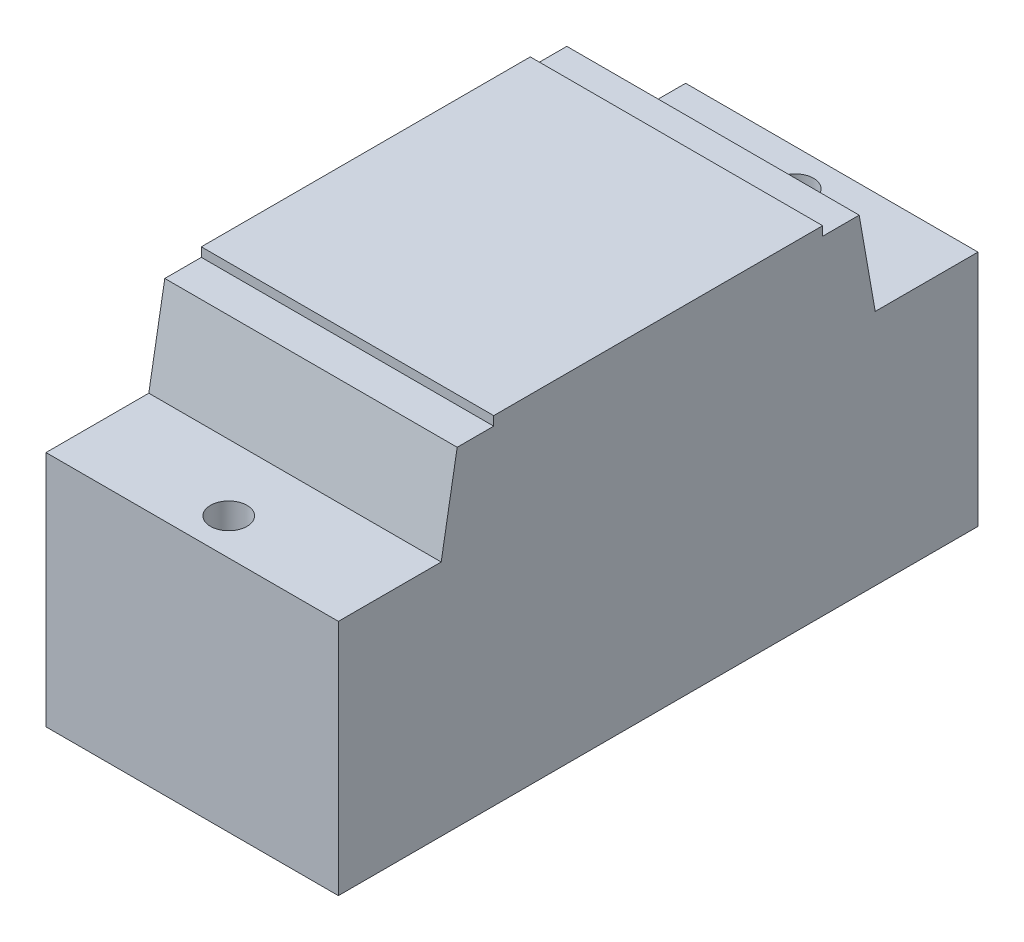
ISO-10303-21;
HEADER;
FILE_DESCRIPTION(('STEP AP214'),'2;1');
FILE_NAME('part.step','',(''),(''),'','','');
FILE_SCHEMA(('AUTOMOTIVE_DESIGN { 1 0 10303 214 1 1 1 1 }'));
ENDSEC;
DATA;
#1=APPLICATION_CONTEXT('core data for automotive mechanical design processes');
#2=APPLICATION_PROTOCOL_DEFINITION('international standard','automotive_design',2000,#1);
#3=PRODUCT_CONTEXT('',#1,'mechanical');
#4=PRODUCT('Part','Part','',(#3));
#5=PRODUCT_RELATED_PRODUCT_CATEGORY('part','',(#4));
#6=PRODUCT_DEFINITION_FORMATION('','',#4);
#7=PRODUCT_DEFINITION_CONTEXT('part definition',#1,'design');
#8=PRODUCT_DEFINITION('design','',#6,#7);
#9=PRODUCT_DEFINITION_SHAPE('','',#8);
#10=(LENGTH_UNIT() NAMED_UNIT(*) SI_UNIT(.MILLI.,.METRE.));
#11=(NAMED_UNIT(*) PLANE_ANGLE_UNIT() SI_UNIT($,.RADIAN.));
#12=(NAMED_UNIT(*) SI_UNIT($,.STERADIAN.) SOLID_ANGLE_UNIT());
#13=UNCERTAINTY_MEASURE_WITH_UNIT(LENGTH_MEASURE(1.E-05),#10,'distance_accuracy_value','');
#14=(GEOMETRIC_REPRESENTATION_CONTEXT(3) GLOBAL_UNCERTAINTY_ASSIGNED_CONTEXT((#13)) GLOBAL_UNIT_ASSIGNED_CONTEXT((#10,
#11,#12)) REPRESENTATION_CONTEXT('',''));
#15=CARTESIAN_POINT('',(0.,0.,0.));
#16=DIRECTION('',(0.,0.,1.));
#17=DIRECTION('',(1.,0.,0.));
#18=AXIS2_PLACEMENT_3D('',#15,#16,#17);
#19=CARTESIAN_POINT('',(0.,26.,0.));
#20=DIRECTION('',(0.,1.,0.));
#21=DIRECTION('',(0.,0.,1.));
#22=AXIS2_PLACEMENT_3D('',#19,#20,#21);
#23=PLANE('',#22);
#24=CARTESIAN_POINT('',(0.,26.,-31.));
#25=DIRECTION('',(0.,1.,0.));
#26=DIRECTION('',(0.,0.,1.));
#27=AXIS2_PLACEMENT_3D('',#24,#25,#26);
#28=CIRCLE('',#27,2.);
#29=CARTESIAN_POINT('',(0.,26.,-29.));
#30=VERTEX_POINT('',#29);
#31=EDGE_CURVE('E216',#30,#30,#28,.T.);
#32=ORIENTED_EDGE('',*,*,#31,.F.);
#33=EDGE_LOOP('',(#32));
#34=FACE_BOUND('',#33,.T.);
#35=DIRECTION('',(0.,0.,1.));
#36=VECTOR('',#35,1.);
#37=CARTESIAN_POINT('',(-16.,26.,-35.));
#38=LINE('',#37,#36);
#39=CARTESIAN_POINT('',(-16.,26.,-35.));
#40=VERTEX_POINT('',#39);
#41=CARTESIAN_POINT('',(-16.,26.,-23.75));
#42=VERTEX_POINT('',#41);
#43=EDGE_CURVE('E141',#40,#42,#38,.T.);
#44=ORIENTED_EDGE('',*,*,#43,.T.);
#45=DIRECTION('',(1.,0.,0.));
#46=VECTOR('',#45,1.);
#47=CARTESIAN_POINT('',(-16.,26.,-23.75));
#48=LINE('',#47,#46);
#49=CARTESIAN_POINT('',(16.,26.,-23.75));
#50=VERTEX_POINT('',#49);
#51=EDGE_CURVE('E147',#42,#50,#48,.T.);
#52=ORIENTED_EDGE('',*,*,#51,.T.);
#53=DIRECTION('',(0.,0.,-1.));
#54=VECTOR('',#53,1.);
#55=CARTESIAN_POINT('',(16.,26.,-35.));
#56=LINE('',#55,#54);
#57=CARTESIAN_POINT('',(16.,26.,-35.));
#58=VERTEX_POINT('',#57);
#59=EDGE_CURVE('E88',#50,#58,#56,.T.);
#60=ORIENTED_EDGE('',*,*,#59,.T.);
#61=DIRECTION('',(-1.,0.,0.));
#62=VECTOR('',#61,1.);
#63=CARTESIAN_POINT('',(-16.,26.,-35.));
#64=LINE('',#63,#62);
#65=EDGE_CURVE('E152',#58,#40,#64,.T.);
#66=ORIENTED_EDGE('',*,*,#65,.T.);
#67=EDGE_LOOP('',(#44,#52,#60,#66));
#68=FACE_BOUND('',#67,.T.);
#69=ADVANCED_FACE('F36',(#34,#68),#23,.T.);
#70=CARTESIAN_POINT('',(16.,26.,-35.));
#71=DIRECTION('',(-1.,0.,0.));
#72=DIRECTION('',(0.,0.,1.));
#73=AXIS2_PLACEMENT_3D('',#70,#71,#72);
#74=PLANE('',#73);
#75=DIRECTION('',(0.,0.,-1.));
#76=VECTOR('',#75,1.);
#77=CARTESIAN_POINT('',(16.,0.,-35.));
#78=LINE('',#77,#76);
#79=CARTESIAN_POINT('',(16.,0.,35.));
#80=VERTEX_POINT('',#79);
#81=CARTESIAN_POINT('',(16.,0.,-35.));
#82=VERTEX_POINT('',#81);
#83=EDGE_CURVE('E161',#80,#82,#78,.T.);
#84=ORIENTED_EDGE('',*,*,#83,.T.);
#85=DIRECTION('',(0.,-1.,0.));
#86=VECTOR('',#85,1.);
#87=CARTESIAN_POINT('',(16.,26.,-35.));
#88=LINE('',#87,#86);
#89=EDGE_CURVE('E11',#58,#82,#88,.T.);
#90=ORIENTED_EDGE('',*,*,#89,.F.);
#91=ORIENTED_EDGE('',*,*,#59,.F.);
#92=DIRECTION('',(0.,-0.985030467155705,-0.172380331752247));
#93=VECTOR('',#92,1.);
#94=CARTESIAN_POINT('',(16.,4.8053365676167,-27.4590661006671));
#95=LINE('',#94,#93);
#96=CARTESIAN_POINT('',(16.,36.,-22.));
#97=VERTEX_POINT('',#96);
#98=EDGE_CURVE('E51',#97,#50,#95,.T.);
#99=ORIENTED_EDGE('',*,*,#98,.F.);
#100=DIRECTION('',(0.,0.,-1.));
#101=VECTOR('',#100,1.);
#102=CARTESIAN_POINT('',(16.,36.,0.));
#103=LINE('',#102,#101);
#104=CARTESIAN_POINT('',(16.,36.,-17.9999999999999));
#105=VERTEX_POINT('',#104);
#106=EDGE_CURVE('E209',#105,#97,#103,.T.);
#107=ORIENTED_EDGE('',*,*,#106,.F.);
#108=DIRECTION('',(0.,-1.,0.));
#109=VECTOR('',#108,1.);
#110=CARTESIAN_POINT('',(16.,0.,-17.9999999999999));
#111=LINE('',#110,#109);
#112=CARTESIAN_POINT('',(16.,37.,-17.9999999999999));
#113=VERTEX_POINT('',#112);
#114=EDGE_CURVE('E212',#113,#105,#111,.T.);
#115=ORIENTED_EDGE('',*,*,#114,.F.);
#116=DIRECTION('',(0.,0.,-1.));
#117=VECTOR('',#116,1.);
#118=CARTESIAN_POINT('',(16.,37.,0.));
#119=LINE('',#118,#117);
#120=CARTESIAN_POINT('',(16.,37.,18.0000000000001));
#121=VERTEX_POINT('',#120);
#122=EDGE_CURVE('E222',#121,#113,#119,.T.);
#123=ORIENTED_EDGE('',*,*,#122,.F.);
#124=DIRECTION('',(0.,-1.,0.));
#125=VECTOR('',#124,1.);
#126=CARTESIAN_POINT('',(16.,0.,18.0000000000001));
#127=LINE('',#126,#125);
#128=CARTESIAN_POINT('',(16.,36.,18.0000000000001));
#129=VERTEX_POINT('',#128);
#130=EDGE_CURVE('E223',#121,#129,#127,.T.);
#131=ORIENTED_EDGE('',*,*,#130,.T.);
#132=CARTESIAN_POINT('',(16.,36.,22.));
#133=VERTEX_POINT('',#132);
#134=EDGE_CURVE('E214',#133,#129,#103,.T.);
#135=ORIENTED_EDGE('',*,*,#134,.F.);
#136=DIRECTION('',(0.,-0.985030467155704,0.17238033175225));
#137=VECTOR('',#136,1.);
#138=CARTESIAN_POINT('',(16.,4.80533656761679,27.4590661006671));
#139=LINE('',#138,#137);
#140=CARTESIAN_POINT('',(16.,26.,23.75));
#141=VERTEX_POINT('',#140);
#142=EDGE_CURVE('E145',#133,#141,#139,.T.);
#143=ORIENTED_EDGE('',*,*,#142,.T.);
#144=CARTESIAN_POINT('',(16.,26.,35.));
#145=VERTEX_POINT('',#144);
#146=EDGE_CURVE('E182',#145,#141,#56,.T.);
#147=ORIENTED_EDGE('',*,*,#146,.F.);
#148=DIRECTION('',(0.,-1.,0.));
#149=VECTOR('',#148,1.);
#150=CARTESIAN_POINT('',(16.,26.,35.));
#151=LINE('',#150,#149);
#152=EDGE_CURVE('E156',#145,#80,#151,.T.);
#153=ORIENTED_EDGE('',*,*,#152,.T.);
#154=EDGE_LOOP('',(#84,#90,#91,#99,#107,#115,#123,#131,#135,#143,#147,#153));
#155=FACE_BOUND('',#154,.T.);
#156=ADVANCED_FACE('F38',(#155),#74,.F.);
#157=CARTESIAN_POINT('',(-16.,26.,-35.));
#158=DIRECTION('',(0.,0.,1.));
#159=DIRECTION('',(1.,0.,0.));
#160=AXIS2_PLACEMENT_3D('',#157,#158,#159);
#161=PLANE('',#160);
#162=DIRECTION('',(-1.,0.,0.));
#163=VECTOR('',#162,1.);
#164=CARTESIAN_POINT('',(-16.,0.,-35.));
#165=LINE('',#164,#163);
#166=CARTESIAN_POINT('',(-16.,0.,-35.));
#167=VERTEX_POINT('',#166);
#168=EDGE_CURVE('E164',#82,#167,#165,.T.);
#169=ORIENTED_EDGE('',*,*,#168,.T.);
#170=DIRECTION('',(0.,-1.,0.));
#171=VECTOR('',#170,1.);
#172=CARTESIAN_POINT('',(-16.,26.,-35.));
#173=LINE('',#172,#171);
#174=EDGE_CURVE('E44',#40,#167,#173,.T.);
#175=ORIENTED_EDGE('',*,*,#174,.F.);
#176=ORIENTED_EDGE('',*,*,#65,.F.);
#177=ORIENTED_EDGE('',*,*,#89,.T.);
#178=EDGE_LOOP('',(#169,#175,#176,#177));
#179=FACE_BOUND('',#178,.T.);
#180=ADVANCED_FACE('F271',(#179),#161,.F.);
#181=CARTESIAN_POINT('',(-16.,26.,-35.));
#182=DIRECTION('',(1.,0.,0.));
#183=DIRECTION('',(0.,0.,-1.));
#184=AXIS2_PLACEMENT_3D('',#181,#182,#183);
#185=PLANE('',#184);
#186=DIRECTION('',(0.,0.,1.));
#187=VECTOR('',#186,1.);
#188=CARTESIAN_POINT('',(-16.,0.,-35.));
#189=LINE('',#188,#187);
#190=CARTESIAN_POINT('',(-16.,0.,35.));
#191=VERTEX_POINT('',#190);
#192=EDGE_CURVE('E167',#167,#191,#189,.T.);
#193=ORIENTED_EDGE('',*,*,#192,.T.);
#194=DIRECTION('',(0.,-1.,0.));
#195=VECTOR('',#194,1.);
#196=CARTESIAN_POINT('',(-16.,26.,35.));
#197=LINE('',#196,#195);
#198=CARTESIAN_POINT('',(-16.,26.,35.));
#199=VERTEX_POINT('',#198);
#200=EDGE_CURVE('E171',#199,#191,#197,.T.);
#201=ORIENTED_EDGE('',*,*,#200,.F.);
#202=CARTESIAN_POINT('',(-16.,26.,23.75));
#203=VERTEX_POINT('',#202);
#204=EDGE_CURVE('E154',#203,#199,#38,.T.);
#205=ORIENTED_EDGE('',*,*,#204,.F.);
#206=DIRECTION('',(0.,-0.985030467155704,0.17238033175225));
#207=VECTOR('',#206,1.);
#208=CARTESIAN_POINT('',(-16.,4.80533656761679,27.4590661006671));
#209=LINE('',#208,#207);
#210=CARTESIAN_POINT('',(-16.,36.,22.));
#211=VERTEX_POINT('',#210);
#212=EDGE_CURVE('E150',#211,#203,#209,.T.);
#213=ORIENTED_EDGE('',*,*,#212,.F.);
#214=DIRECTION('',(0.,0.,-1.));
#215=VECTOR('',#214,1.);
#216=CARTESIAN_POINT('',(-16.,36.,0.));
#217=LINE('',#216,#215);
#218=CARTESIAN_POINT('',(-16.,36.,18.0000000000001));
#219=VERTEX_POINT('',#218);
#220=EDGE_CURVE('E233',#211,#219,#217,.T.);
#221=ORIENTED_EDGE('',*,*,#220,.T.);
#222=DIRECTION('',(0.,-1.,0.));
#223=VECTOR('',#222,1.);
#224=CARTESIAN_POINT('',(-16.,0.,18.0000000000001));
#225=LINE('',#224,#223);
#226=CARTESIAN_POINT('',(-16.,37.,18.0000000000001));
#227=VERTEX_POINT('',#226);
#228=EDGE_CURVE('E237',#227,#219,#225,.T.);
#229=ORIENTED_EDGE('',*,*,#228,.F.);
#230=DIRECTION('',(0.,0.,-1.));
#231=VECTOR('',#230,1.);
#232=CARTESIAN_POINT('',(-16.,37.,0.));
#233=LINE('',#232,#231);
#234=CARTESIAN_POINT('',(-16.,37.,-17.9999999999999));
#235=VERTEX_POINT('',#234);
#236=EDGE_CURVE('E239',#227,#235,#233,.T.);
#237=ORIENTED_EDGE('',*,*,#236,.T.);
#238=DIRECTION('',(0.,-1.,0.));
#239=VECTOR('',#238,1.);
#240=CARTESIAN_POINT('',(-16.,0.,-17.9999999999999));
#241=LINE('',#240,#239);
#242=CARTESIAN_POINT('',(-16.,36.,-17.9999999999999));
#243=VERTEX_POINT('',#242);
#244=EDGE_CURVE('E241',#235,#243,#241,.T.);
#245=ORIENTED_EDGE('',*,*,#244,.T.);
#246=CARTESIAN_POINT('',(-16.,36.,-22.));
#247=VERTEX_POINT('',#246);
#248=EDGE_CURVE('E143',#243,#247,#217,.T.);
#249=ORIENTED_EDGE('',*,*,#248,.T.);
#250=DIRECTION('',(0.,-0.985030467155705,-0.172380331752247));
#251=VECTOR('',#250,1.);
#252=CARTESIAN_POINT('',(-16.,4.8053365676167,-27.459066100667));
#253=LINE('',#252,#251);
#254=EDGE_CURVE('E137',#247,#42,#253,.T.);
#255=ORIENTED_EDGE('',*,*,#254,.T.);
#256=ORIENTED_EDGE('',*,*,#43,.F.);
#257=ORIENTED_EDGE('',*,*,#174,.T.);
#258=EDGE_LOOP('',(#193,#201,#205,#213,#221,#229,#237,#245,#249,#255,#256,#257));
#259=FACE_BOUND('',#258,.T.);
#260=ADVANCED_FACE('F138',(#259),#185,.F.);
#261=CARTESIAN_POINT('',(-16.,26.,35.));
#262=DIRECTION('',(0.,0.,-1.));
#263=DIRECTION('',(-1.,0.,0.));
#264=AXIS2_PLACEMENT_3D('',#261,#262,#263);
#265=PLANE('',#264);
#266=DIRECTION('',(1.,0.,0.));
#267=VECTOR('',#266,1.);
#268=CARTESIAN_POINT('',(-16.,0.,35.));
#269=LINE('',#268,#267);
#270=EDGE_CURVE('E81',#191,#80,#269,.T.);
#271=ORIENTED_EDGE('',*,*,#270,.T.);
#272=ORIENTED_EDGE('',*,*,#152,.F.);
#273=DIRECTION('',(1.,0.,0.));
#274=VECTOR('',#273,1.);
#275=CARTESIAN_POINT('',(-16.,26.,35.));
#276=LINE('',#275,#274);
#277=EDGE_CURVE('E60',#199,#145,#276,.T.);
#278=ORIENTED_EDGE('',*,*,#277,.F.);
#279=ORIENTED_EDGE('',*,*,#200,.T.);
#280=EDGE_LOOP('',(#271,#272,#278,#279));
#281=FACE_BOUND('',#280,.T.);
#282=ADVANCED_FACE('F183',(#281),#265,.F.);
#283=CARTESIAN_POINT('',(0.,26.,31.));
#284=DIRECTION('',(0.,1.,0.));
#285=DIRECTION('',(0.,0.,1.));
#286=AXIS2_PLACEMENT_3D('',#283,#284,#285);
#287=CIRCLE('',#286,2.);
#288=CARTESIAN_POINT('',(0.,26.,33.));
#289=VERTEX_POINT('',#288);
#290=EDGE_CURVE('E210',#289,#289,#287,.T.);
#291=ORIENTED_EDGE('',*,*,#290,.F.);
#292=EDGE_LOOP('',(#291));
#293=FACE_BOUND('',#292,.T.);
#294=DIRECTION('',(1.,0.,0.));
#295=VECTOR('',#294,1.);
#296=CARTESIAN_POINT('',(-16.,26.,23.75));
#297=LINE('',#296,#295);
#298=EDGE_CURVE('E165',#203,#141,#297,.T.);
#299=ORIENTED_EDGE('',*,*,#298,.F.);
#300=ORIENTED_EDGE('',*,*,#204,.T.);
#301=ORIENTED_EDGE('',*,*,#277,.T.);
#302=ORIENTED_EDGE('',*,*,#146,.T.);
#303=EDGE_LOOP('',(#299,#300,#301,#302));
#304=FACE_BOUND('',#303,.T.);
#305=ADVANCED_FACE('F187',(#293,#304),#23,.T.);
#306=CARTESIAN_POINT('',(0.,0.,0.));
#307=DIRECTION('',(0.,1.,0.));
#308=DIRECTION('',(0.,0.,1.));
#309=AXIS2_PLACEMENT_3D('',#306,#307,#308);
#310=PLANE('',#309);
#311=CARTESIAN_POINT('',(0.,0.,31.));
#312=DIRECTION('',(0.,-1.,0.));
#313=DIRECTION('',(0.,0.,-1.));
#314=AXIS2_PLACEMENT_3D('',#311,#312,#313);
#315=CIRCLE('',#314,2.);
#316=CARTESIAN_POINT('',(0.,0.,29.));
#317=VERTEX_POINT('',#316);
#318=EDGE_CURVE('E290',#317,#317,#315,.T.);
#319=ORIENTED_EDGE('',*,*,#318,.F.);
#320=EDGE_LOOP('',(#319));
#321=FACE_BOUND('',#320,.T.);
#322=CARTESIAN_POINT('',(0.,0.,-31.));
#323=DIRECTION('',(0.,-1.,0.));
#324=DIRECTION('',(0.,0.,1.));
#325=AXIS2_PLACEMENT_3D('',#322,#323,#324);
#326=CIRCLE('',#325,2.);
#327=CARTESIAN_POINT('',(0.,0.,-29.));
#328=VERTEX_POINT('',#327);
#329=EDGE_CURVE('E291',#328,#328,#326,.T.);
#330=ORIENTED_EDGE('',*,*,#329,.F.);
#331=EDGE_LOOP('',(#330));
#332=FACE_BOUND('',#331,.T.);
#333=ORIENTED_EDGE('',*,*,#83,.F.);
#334=ORIENTED_EDGE('',*,*,#270,.F.);
#335=ORIENTED_EDGE('',*,*,#192,.F.);
#336=ORIENTED_EDGE('',*,*,#168,.F.);
#337=EDGE_LOOP('',(#333,#334,#335,#336));
#338=FACE_BOUND('',#337,.T.);
#339=ADVANCED_FACE('F177',(#321,#332,#338),#310,.F.);
#340=CARTESIAN_POINT('',(-16.,4.80533656761679,27.4590661006671));
#341=DIRECTION('',(0.,0.17238033175225,0.985030467155704));
#342=DIRECTION('',(0.,-0.985030467155704,0.17238033175225));
#343=AXIS2_PLACEMENT_3D('',#340,#341,#342);
#344=PLANE('',#343);
#345=ORIENTED_EDGE('',*,*,#142,.F.);
#346=DIRECTION('',(1.,0.,0.));
#347=VECTOR('',#346,1.);
#348=CARTESIAN_POINT('',(-16.,36.,22.));
#349=LINE('',#348,#347);
#350=EDGE_CURVE('E190',#211,#133,#349,.T.);
#351=ORIENTED_EDGE('',*,*,#350,.F.);
#352=ORIENTED_EDGE('',*,*,#212,.T.);
#353=ORIENTED_EDGE('',*,*,#298,.T.);
#354=EDGE_LOOP('',(#345,#351,#352,#353));
#355=FACE_BOUND('',#354,.T.);
#356=ADVANCED_FACE('F231',(#355),#344,.T.);
#357=CARTESIAN_POINT('',(-16.,36.,0.));
#358=DIRECTION('',(0.,-1.,0.));
#359=DIRECTION('',(0.,0.,-1.));
#360=AXIS2_PLACEMENT_3D('',#357,#358,#359);
#361=PLANE('',#360);
#362=ORIENTED_EDGE('',*,*,#134,.T.);
#363=DIRECTION('',(1.,0.,0.));
#364=VECTOR('',#363,1.);
#365=CARTESIAN_POINT('',(-16.,36.,18.0000000000001));
#366=LINE('',#365,#364);
#367=EDGE_CURVE('E192',#219,#129,#366,.T.);
#368=ORIENTED_EDGE('',*,*,#367,.F.);
#369=ORIENTED_EDGE('',*,*,#220,.F.);
#370=ORIENTED_EDGE('',*,*,#350,.T.);
#371=EDGE_LOOP('',(#362,#368,#369,#370));
#372=FACE_BOUND('',#371,.T.);
#373=ADVANCED_FACE('F234',(#372),#361,.F.);
#374=CARTESIAN_POINT('',(-16.,0.,18.0000000000001));
#375=DIRECTION('',(0.,0.,1.));
#376=DIRECTION('',(1.,0.,0.));
#377=AXIS2_PLACEMENT_3D('',#374,#375,#376);
#378=PLANE('',#377);
#379=ORIENTED_EDGE('',*,*,#130,.F.);
#380=DIRECTION('',(1.,0.,0.));
#381=VECTOR('',#380,1.);
#382=CARTESIAN_POINT('',(-16.,37.,18.0000000000001));
#383=LINE('',#382,#381);
#384=EDGE_CURVE('E198',#227,#121,#383,.T.);
#385=ORIENTED_EDGE('',*,*,#384,.F.);
#386=ORIENTED_EDGE('',*,*,#228,.T.);
#387=ORIENTED_EDGE('',*,*,#367,.T.);
#388=EDGE_LOOP('',(#379,#385,#386,#387));
#389=FACE_BOUND('',#388,.T.);
#390=ADVANCED_FACE('F264',(#389),#378,.T.);
#391=CARTESIAN_POINT('',(-16.,37.,0.));
#392=DIRECTION('',(0.,-1.,0.));
#393=DIRECTION('',(0.,0.,-1.));
#394=AXIS2_PLACEMENT_3D('',#391,#392,#393);
#395=PLANE('',#394);
#396=ORIENTED_EDGE('',*,*,#122,.T.);
#397=DIRECTION('',(1.,0.,0.));
#398=VECTOR('',#397,1.);
#399=CARTESIAN_POINT('',(-16.,37.,-17.9999999999999));
#400=LINE('',#399,#398);
#401=EDGE_CURVE('E200',#235,#113,#400,.T.);
#402=ORIENTED_EDGE('',*,*,#401,.F.);
#403=ORIENTED_EDGE('',*,*,#236,.F.);
#404=ORIENTED_EDGE('',*,*,#384,.T.);
#405=EDGE_LOOP('',(#396,#402,#403,#404));
#406=FACE_BOUND('',#405,.T.);
#407=ADVANCED_FACE('F248',(#406),#395,.F.);
#408=CARTESIAN_POINT('',(-16.,0.,-17.9999999999999));
#409=DIRECTION('',(0.,0.,1.));
#410=DIRECTION('',(1.,0.,0.));
#411=AXIS2_PLACEMENT_3D('',#408,#409,#410);
#412=PLANE('',#411);
#413=ORIENTED_EDGE('',*,*,#114,.T.);
#414=DIRECTION('',(1.,0.,0.));
#415=VECTOR('',#414,1.);
#416=CARTESIAN_POINT('',(-16.,36.,-17.9999999999999));
#417=LINE('',#416,#415);
#418=EDGE_CURVE('E203',#243,#105,#417,.T.);
#419=ORIENTED_EDGE('',*,*,#418,.F.);
#420=ORIENTED_EDGE('',*,*,#244,.F.);
#421=ORIENTED_EDGE('',*,*,#401,.T.);
#422=EDGE_LOOP('',(#413,#419,#420,#421));
#423=FACE_BOUND('',#422,.T.);
#424=ADVANCED_FACE('F250',(#423),#412,.F.);
#425=ORIENTED_EDGE('',*,*,#106,.T.);
#426=DIRECTION('',(1.,0.,0.));
#427=VECTOR('',#426,1.);
#428=CARTESIAN_POINT('',(-16.,36.,-22.));
#429=LINE('',#428,#427);
#430=EDGE_CURVE('E149',#247,#97,#429,.T.);
#431=ORIENTED_EDGE('',*,*,#430,.F.);
#432=ORIENTED_EDGE('',*,*,#248,.F.);
#433=ORIENTED_EDGE('',*,*,#418,.T.);
#434=EDGE_LOOP('',(#425,#431,#432,#433));
#435=FACE_BOUND('',#434,.T.);
#436=ADVANCED_FACE('F251',(#435),#361,.F.);
#437=CARTESIAN_POINT('',(-16.,4.8053365676167,-27.459066100667));
#438=DIRECTION('',(0.,-0.172380331752247,0.985030467155704));
#439=DIRECTION('',(0.,-0.985030467155705,-0.172380331752247));
#440=AXIS2_PLACEMENT_3D('',#437,#438,#439);
#441=PLANE('',#440);
#442=ORIENTED_EDGE('',*,*,#98,.T.);
#443=ORIENTED_EDGE('',*,*,#51,.F.);
#444=ORIENTED_EDGE('',*,*,#254,.F.);
#445=ORIENTED_EDGE('',*,*,#430,.T.);
#446=EDGE_LOOP('',(#442,#443,#444,#445));
#447=FACE_BOUND('',#446,.T.);
#448=ADVANCED_FACE('F148',(#447),#441,.F.);
#449=CARTESIAN_POINT('',(0.,37.,-31.));
#450=DIRECTION('',(0.,-1.,0.));
#451=DIRECTION('',(0.,0.,-1.));
#452=AXIS2_PLACEMENT_3D('',#449,#450,#451);
#453=CYLINDRICAL_SURFACE('',#452,2.);
#454=ORIENTED_EDGE('',*,*,#31,.T.);
#455=EDGE_LOOP('',(#454));
#456=FACE_BOUND('',#455,.T.);
#457=ORIENTED_EDGE('',*,*,#329,.T.);
#458=EDGE_LOOP('',(#457));
#459=FACE_BOUND('',#458,.T.);
#460=ADVANCED_FACE('F258',(#456,#459),#453,.F.);
#461=CARTESIAN_POINT('',(0.,37.,31.));
#462=DIRECTION('',(0.,-1.,0.));
#463=DIRECTION('',(0.,0.,-1.));
#464=AXIS2_PLACEMENT_3D('',#461,#462,#463);
#465=CYLINDRICAL_SURFACE('',#464,2.);
#466=ORIENTED_EDGE('',*,*,#290,.T.);
#467=EDGE_LOOP('',(#466));
#468=FACE_BOUND('',#467,.T.);
#469=ORIENTED_EDGE('',*,*,#318,.T.);
#470=EDGE_LOOP('',(#469));
#471=FACE_BOUND('',#470,.T.);
#472=ADVANCED_FACE('F284',(#468,#471),#465,.F.);
#473=CLOSED_SHELL('',(#69,#156,#180,#260,#282,#305,#339,#356,#373,#390,#407,#424,#436,#448,#460,#472));
#474=MANIFOLD_SOLID_BREP('B2',#473);
#475=ADVANCED_BREP_SHAPE_REPRESENTATION('',(#18,#474),#14);
#476=SHAPE_DEFINITION_REPRESENTATION(#9,#475);
ENDSEC;
END-ISO-10303-21;
